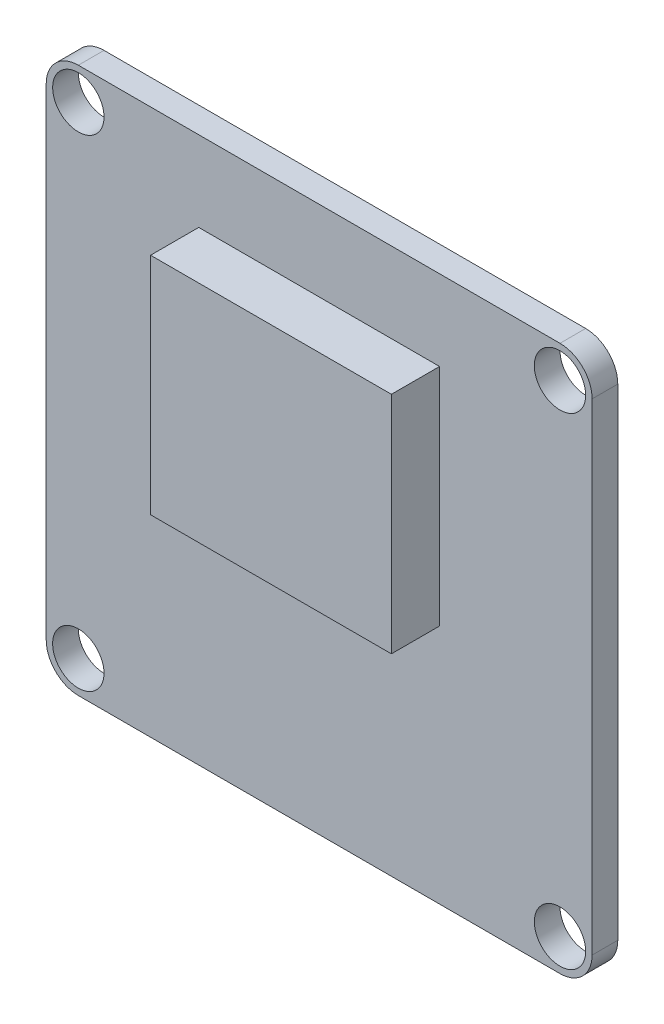
ISO-10303-21;
HEADER;
FILE_DESCRIPTION(('STEP AP214'),'2;1');
FILE_NAME('part.step','',(''),(''),'','','');
FILE_SCHEMA(('AUTOMOTIVE_DESIGN { 1 0 10303 214 1 1 1 1 }'));
ENDSEC;
DATA;
#1=APPLICATION_CONTEXT('core data for automotive mechanical design processes');
#2=APPLICATION_PROTOCOL_DEFINITION('international standard','automotive_design',2000,#1);
#3=PRODUCT_CONTEXT('',#1,'mechanical');
#4=PRODUCT('Part','Part','',(#3));
#5=PRODUCT_RELATED_PRODUCT_CATEGORY('part','',(#4));
#6=PRODUCT_DEFINITION_FORMATION('','',#4);
#7=PRODUCT_DEFINITION_CONTEXT('part definition',#1,'design');
#8=PRODUCT_DEFINITION('design','',#6,#7);
#9=PRODUCT_DEFINITION_SHAPE('','',#8);
#10=(LENGTH_UNIT() NAMED_UNIT(*) SI_UNIT(.MILLI.,.METRE.));
#11=(NAMED_UNIT(*) PLANE_ANGLE_UNIT() SI_UNIT($,.RADIAN.));
#12=(NAMED_UNIT(*) SI_UNIT($,.STERADIAN.) SOLID_ANGLE_UNIT());
#13=UNCERTAINTY_MEASURE_WITH_UNIT(LENGTH_MEASURE(1.E-05),#10,'distance_accuracy_value','');
#14=(GEOMETRIC_REPRESENTATION_CONTEXT(3) GLOBAL_UNCERTAINTY_ASSIGNED_CONTEXT((#13)) GLOBAL_UNIT_ASSIGNED_CONTEXT((#10,
#11,#12)) REPRESENTATION_CONTEXT('',''));
#15=CARTESIAN_POINT('',(0.,0.,0.));
#16=DIRECTION('',(0.,0.,1.));
#17=DIRECTION('',(1.,0.,0.));
#18=AXIS2_PLACEMENT_3D('',#15,#16,#17);
#19=CARTESIAN_POINT('',(-13.2356576243425,11.611622238612,1.6));
#20=DIRECTION('',(0.,0.,1.));
#21=DIRECTION('',(1.,0.,0.));
#22=AXIS2_PLACEMENT_3D('',#19,#20,#21);
#23=PLANE('',#22);
#24=CARTESIAN_POINT('',(-13.2356576243425,11.611622238612,1.6));
#25=DIRECTION('',(0.,0.,1.));
#26=DIRECTION('',(-1.,0.,0.));
#27=AXIS2_PLACEMENT_3D('',#24,#25,#26);
#28=CIRCLE('',#27,1.6);
#29=CARTESIAN_POINT('',(-14.8356576243425,11.611622238612,1.6));
#30=VERTEX_POINT('',#29);
#31=EDGE_CURVE('E203',#30,#30,#28,.T.);
#32=ORIENTED_EDGE('',*,*,#31,.F.);
#33=EDGE_LOOP('',(#32));
#34=FACE_BOUND('',#33,.T.);
#35=CARTESIAN_POINT('',(16.7643423756575,11.611622238612,1.6));
#36=DIRECTION('',(0.,0.,1.));
#37=DIRECTION('',(1.,0.,0.));
#38=AXIS2_PLACEMENT_3D('',#35,#36,#37);
#39=CIRCLE('',#38,1.6);
#40=CARTESIAN_POINT('',(18.3643423756575,11.611622238612,1.6));
#41=VERTEX_POINT('',#40);
#42=EDGE_CURVE('E148',#41,#41,#39,.T.);
#43=ORIENTED_EDGE('',*,*,#42,.F.);
#44=EDGE_LOOP('',(#43));
#45=FACE_BOUND('',#44,.T.);
#46=CARTESIAN_POINT('',(-13.2356576243425,11.611622238612,1.6));
#47=DIRECTION('',(0.,0.,1.));
#48=DIRECTION('',(1.,0.,0.));
#49=AXIS2_PLACEMENT_3D('',#46,#47,#48);
#50=CIRCLE('',#49,2.);
#51=CARTESIAN_POINT('',(-13.2356576243425,13.611622238612,1.6));
#52=VERTEX_POINT('',#51);
#53=CARTESIAN_POINT('',(-15.2356576243425,11.611622238612,1.6));
#54=VERTEX_POINT('',#53);
#55=EDGE_CURVE('E160',#52,#54,#50,.T.);
#56=ORIENTED_EDGE('',*,*,#55,.T.);
#57=DIRECTION('',(0.,-1.,0.));
#58=VECTOR('',#57,1.);
#59=CARTESIAN_POINT('',(-15.2356576243425,11.611622238612,1.6));
#60=LINE('',#59,#58);
#61=CARTESIAN_POINT('',(-15.2356576243425,-18.388377761388,1.6));
#62=VERTEX_POINT('',#61);
#63=EDGE_CURVE('E100',#54,#62,#60,.T.);
#64=ORIENTED_EDGE('',*,*,#63,.T.);
#65=CARTESIAN_POINT('',(-13.2356576243425,-18.388377761388,1.6));
#66=DIRECTION('',(0.,0.,1.));
#67=DIRECTION('',(1.,0.,0.));
#68=AXIS2_PLACEMENT_3D('',#65,#66,#67);
#69=CIRCLE('',#68,2.);
#70=CARTESIAN_POINT('',(-13.2356576243425,-20.388377761388,1.6));
#71=VERTEX_POINT('',#70);
#72=EDGE_CURVE('E175',#62,#71,#69,.T.);
#73=ORIENTED_EDGE('',*,*,#72,.T.);
#74=DIRECTION('',(1.,0.,0.));
#75=VECTOR('',#74,1.);
#76=CARTESIAN_POINT('',(-13.2356576243425,-20.388377761388,1.6));
#77=LINE('',#76,#75);
#78=CARTESIAN_POINT('',(16.7643423756575,-20.388377761388,1.6));
#79=VERTEX_POINT('',#78);
#80=EDGE_CURVE('E188',#71,#79,#77,.T.);
#81=ORIENTED_EDGE('',*,*,#80,.T.);
#82=CARTESIAN_POINT('',(16.7643423756575,-18.388377761388,1.6));
#83=DIRECTION('',(0.,0.,1.));
#84=DIRECTION('',(1.,0.,0.));
#85=AXIS2_PLACEMENT_3D('',#82,#83,#84);
#86=CIRCLE('',#85,2.);
#87=CARTESIAN_POINT('',(18.7643423756575,-18.388377761388,1.6));
#88=VERTEX_POINT('',#87);
#89=EDGE_CURVE('E123',#79,#88,#86,.T.);
#90=ORIENTED_EDGE('',*,*,#89,.T.);
#91=DIRECTION('',(0.,1.,0.));
#92=VECTOR('',#91,1.);
#93=CARTESIAN_POINT('',(18.7643423756575,11.611622238612,1.6));
#94=LINE('',#93,#92);
#95=CARTESIAN_POINT('',(18.7643423756575,11.611622238612,1.6));
#96=VERTEX_POINT('',#95);
#97=EDGE_CURVE('E116',#88,#96,#94,.T.);
#98=ORIENTED_EDGE('',*,*,#97,.T.);
#99=CARTESIAN_POINT('',(16.7643423756575,11.611622238612,1.6));
#100=DIRECTION('',(0.,0.,1.));
#101=DIRECTION('',(-1.,0.,0.));
#102=AXIS2_PLACEMENT_3D('',#99,#100,#101);
#103=CIRCLE('',#102,2.);
#104=CARTESIAN_POINT('',(16.7643423756575,13.611622238612,1.6));
#105=VERTEX_POINT('',#104);
#106=EDGE_CURVE('E120',#96,#105,#103,.T.);
#107=ORIENTED_EDGE('',*,*,#106,.T.);
#108=DIRECTION('',(-1.,0.,0.));
#109=VECTOR('',#108,1.);
#110=CARTESIAN_POINT('',(-13.2356576243425,13.611622238612,1.6));
#111=LINE('',#110,#109);
#112=EDGE_CURVE('E59',#105,#52,#111,.T.);
#113=ORIENTED_EDGE('',*,*,#112,.T.);
#114=EDGE_LOOP('',(#56,#64,#73,#81,#90,#98,#107,#113));
#115=FACE_BOUND('',#114,.T.);
#116=CARTESIAN_POINT('',(16.7643423756575,-18.388377761388,1.6));
#117=DIRECTION('',(0.,0.,1.));
#118=DIRECTION('',(-1.,0.,0.));
#119=AXIS2_PLACEMENT_3D('',#116,#117,#118);
#120=CIRCLE('',#119,1.6);
#121=CARTESIAN_POINT('',(15.1643423756575,-18.388377761388,1.6));
#122=VERTEX_POINT('',#121);
#123=EDGE_CURVE('E197',#122,#122,#120,.T.);
#124=ORIENTED_EDGE('',*,*,#123,.F.);
#125=EDGE_LOOP('',(#124));
#126=FACE_BOUND('',#125,.T.);
#127=CARTESIAN_POINT('',(-13.2356576243425,-18.388377761388,1.6));
#128=DIRECTION('',(0.,0.,1.));
#129=DIRECTION('',(1.,0.,0.));
#130=AXIS2_PLACEMENT_3D('',#127,#128,#129);
#131=CIRCLE('',#130,1.6);
#132=CARTESIAN_POINT('',(-11.6356576243425,-18.388377761388,1.6));
#133=VERTEX_POINT('',#132);
#134=EDGE_CURVE('E209',#133,#133,#131,.T.);
#135=ORIENTED_EDGE('',*,*,#134,.F.);
#136=EDGE_LOOP('',(#135));
#137=FACE_BOUND('',#136,.T.);
#138=DIRECTION('',(-1.,0.,0.));
#139=VECTOR('',#138,1.);
#140=CARTESIAN_POINT('',(9.26434237565751,8.61162223861204,1.6));
#141=LINE('',#140,#139);
#142=CARTESIAN_POINT('',(9.26434237565751,8.61162223861204,1.6));
#143=VERTEX_POINT('',#142);
#144=CARTESIAN_POINT('',(-5.73565762434249,8.61162223861203,1.6));
#145=VERTEX_POINT('',#144);
#146=EDGE_CURVE('E233',#143,#145,#141,.T.);
#147=ORIENTED_EDGE('',*,*,#146,.F.);
#148=DIRECTION('',(0.,1.,0.));
#149=VECTOR('',#148,1.);
#150=CARTESIAN_POINT('',(9.26434237565751,8.61162223861204,1.6));
#151=LINE('',#150,#149);
#152=CARTESIAN_POINT('',(9.26434237565751,-5.38837776138796,1.6));
#153=VERTEX_POINT('',#152);
#154=EDGE_CURVE('E236',#153,#143,#151,.T.);
#155=ORIENTED_EDGE('',*,*,#154,.F.);
#156=DIRECTION('',(1.,0.,0.));
#157=VECTOR('',#156,1.);
#158=CARTESIAN_POINT('',(9.26434237565751,-5.38837776138796,1.6));
#159=LINE('',#158,#157);
#160=CARTESIAN_POINT('',(-5.73565762434248,-5.38837776138797,1.6));
#161=VERTEX_POINT('',#160);
#162=EDGE_CURVE('E228',#161,#153,#159,.T.);
#163=ORIENTED_EDGE('',*,*,#162,.F.);
#164=DIRECTION('',(0.,-1.,0.));
#165=VECTOR('',#164,1.);
#166=CARTESIAN_POINT('',(-5.73565762434249,8.61162223861203,1.6));
#167=LINE('',#166,#165);
#168=EDGE_CURVE('E231',#145,#161,#167,.T.);
#169=ORIENTED_EDGE('',*,*,#168,.F.);
#170=EDGE_LOOP('',(#147,#155,#163,#169));
#171=FACE_BOUND('',#170,.T.);
#172=ADVANCED_FACE('F35',(#34,#45,#115,#126,#137,#171),#23,.T.);
#173=CARTESIAN_POINT('',(-13.2356576243425,11.611622238612,0.));
#174=DIRECTION('',(0.,0.,1.));
#175=DIRECTION('',(1.,0.,0.));
#176=AXIS2_PLACEMENT_3D('',#173,#174,#175);
#177=PLANE('',#176);
#178=CARTESIAN_POINT('',(-13.2356576243425,11.611622238612,0.));
#179=DIRECTION('',(0.,0.,1.));
#180=DIRECTION('',(1.,0.,0.));
#181=AXIS2_PLACEMENT_3D('',#178,#179,#180);
#182=CIRCLE('',#181,2.);
#183=CARTESIAN_POINT('',(-13.2356576243425,13.611622238612,0.));
#184=VERTEX_POINT('',#183);
#185=CARTESIAN_POINT('',(-15.2356576243425,11.611622238612,0.));
#186=VERTEX_POINT('',#185);
#187=EDGE_CURVE('E144',#184,#186,#182,.T.);
#188=ORIENTED_EDGE('',*,*,#187,.F.);
#189=DIRECTION('',(-1.,0.,0.));
#190=VECTOR('',#189,1.);
#191=CARTESIAN_POINT('',(-13.2356576243425,13.611622238612,0.));
#192=LINE('',#191,#190);
#193=CARTESIAN_POINT('',(16.7643423756575,13.611622238612,0.));
#194=VERTEX_POINT('',#193);
#195=EDGE_CURVE('E92',#194,#184,#192,.T.);
#196=ORIENTED_EDGE('',*,*,#195,.F.);
#197=CARTESIAN_POINT('',(16.7643423756575,11.611622238612,0.));
#198=DIRECTION('',(0.,0.,1.));
#199=DIRECTION('',(-1.,0.,0.));
#200=AXIS2_PLACEMENT_3D('',#197,#198,#199);
#201=CIRCLE('',#200,2.);
#202=CARTESIAN_POINT('',(18.7643423756575,11.611622238612,0.));
#203=VERTEX_POINT('',#202);
#204=EDGE_CURVE('E157',#203,#194,#201,.T.);
#205=ORIENTED_EDGE('',*,*,#204,.F.);
#206=DIRECTION('',(0.,1.,0.));
#207=VECTOR('',#206,1.);
#208=CARTESIAN_POINT('',(18.7643423756575,11.611622238612,0.));
#209=LINE('',#208,#207);
#210=CARTESIAN_POINT('',(18.7643423756575,-18.388377761388,0.));
#211=VERTEX_POINT('',#210);
#212=EDGE_CURVE('E132',#211,#203,#209,.T.);
#213=ORIENTED_EDGE('',*,*,#212,.F.);
#214=CARTESIAN_POINT('',(16.7643423756575,-18.388377761388,0.));
#215=DIRECTION('',(0.,0.,1.));
#216=DIRECTION('',(1.,0.,0.));
#217=AXIS2_PLACEMENT_3D('',#214,#215,#216);
#218=CIRCLE('',#217,2.);
#219=CARTESIAN_POINT('',(16.7643423756575,-20.388377761388,0.));
#220=VERTEX_POINT('',#219);
#221=EDGE_CURVE('E154',#220,#211,#218,.T.);
#222=ORIENTED_EDGE('',*,*,#221,.F.);
#223=DIRECTION('',(1.,0.,0.));
#224=VECTOR('',#223,1.);
#225=CARTESIAN_POINT('',(-13.2356576243425,-20.388377761388,0.));
#226=LINE('',#225,#224);
#227=CARTESIAN_POINT('',(-13.2356576243425,-20.388377761388,0.));
#228=VERTEX_POINT('',#227);
#229=EDGE_CURVE('E152',#228,#220,#226,.T.);
#230=ORIENTED_EDGE('',*,*,#229,.F.);
#231=CARTESIAN_POINT('',(-13.2356576243425,-18.388377761388,0.));
#232=DIRECTION('',(0.,0.,1.));
#233=DIRECTION('',(1.,0.,0.));
#234=AXIS2_PLACEMENT_3D('',#231,#232,#233);
#235=CIRCLE('',#234,2.);
#236=CARTESIAN_POINT('',(-15.2356576243425,-18.388377761388,0.));
#237=VERTEX_POINT('',#236);
#238=EDGE_CURVE('E150',#237,#228,#235,.T.);
#239=ORIENTED_EDGE('',*,*,#238,.F.);
#240=DIRECTION('',(0.,-1.,0.));
#241=VECTOR('',#240,1.);
#242=CARTESIAN_POINT('',(-15.2356576243425,11.611622238612,0.));
#243=LINE('',#242,#241);
#244=EDGE_CURVE('E147',#186,#237,#243,.T.);
#245=ORIENTED_EDGE('',*,*,#244,.F.);
#246=EDGE_LOOP('',(#188,#196,#205,#213,#222,#230,#239,#245));
#247=FACE_BOUND('',#246,.T.);
#248=CARTESIAN_POINT('',(16.7643423756575,11.611622238612,0.));
#249=DIRECTION('',(0.,0.,1.));
#250=DIRECTION('',(1.,0.,0.));
#251=AXIS2_PLACEMENT_3D('',#248,#249,#250);
#252=CIRCLE('',#251,1.6);
#253=CARTESIAN_POINT('',(18.3643423756575,11.611622238612,0.));
#254=VERTEX_POINT('',#253);
#255=EDGE_CURVE('E194',#254,#254,#252,.T.);
#256=ORIENTED_EDGE('',*,*,#255,.T.);
#257=EDGE_LOOP('',(#256));
#258=FACE_BOUND('',#257,.T.);
#259=CARTESIAN_POINT('',(16.7643423756575,-18.388377761388,0.));
#260=DIRECTION('',(0.,0.,1.));
#261=DIRECTION('',(-1.,0.,0.));
#262=AXIS2_PLACEMENT_3D('',#259,#260,#261);
#263=CIRCLE('',#262,1.6);
#264=CARTESIAN_POINT('',(15.1643423756575,-18.388377761388,0.));
#265=VERTEX_POINT('',#264);
#266=EDGE_CURVE('E200',#265,#265,#263,.T.);
#267=ORIENTED_EDGE('',*,*,#266,.T.);
#268=EDGE_LOOP('',(#267));
#269=FACE_BOUND('',#268,.T.);
#270=CARTESIAN_POINT('',(-13.2356576243425,11.611622238612,0.));
#271=DIRECTION('',(0.,0.,1.));
#272=DIRECTION('',(-1.,0.,0.));
#273=AXIS2_PLACEMENT_3D('',#270,#271,#272);
#274=CIRCLE('',#273,1.6);
#275=CARTESIAN_POINT('',(-14.8356576243425,11.611622238612,0.));
#276=VERTEX_POINT('',#275);
#277=EDGE_CURVE('E206',#276,#276,#274,.T.);
#278=ORIENTED_EDGE('',*,*,#277,.T.);
#279=EDGE_LOOP('',(#278));
#280=FACE_BOUND('',#279,.T.);
#281=CARTESIAN_POINT('',(-13.2356576243425,-18.388377761388,0.));
#282=DIRECTION('',(0.,0.,1.));
#283=DIRECTION('',(1.,0.,0.));
#284=AXIS2_PLACEMENT_3D('',#281,#282,#283);
#285=CIRCLE('',#284,1.6);
#286=CARTESIAN_POINT('',(-11.6356576243425,-18.388377761388,0.));
#287=VERTEX_POINT('',#286);
#288=EDGE_CURVE('E212',#287,#287,#285,.T.);
#289=ORIENTED_EDGE('',*,*,#288,.T.);
#290=EDGE_LOOP('',(#289));
#291=FACE_BOUND('',#290,.T.);
#292=ADVANCED_FACE('F179',(#247,#258,#269,#280,#291),#177,.F.);
#293=CARTESIAN_POINT('',(-13.2356576243425,11.611622238612,1.6));
#294=DIRECTION('',(0.,0.,-1.));
#295=DIRECTION('',(-1.,0.,0.));
#296=AXIS2_PLACEMENT_3D('',#293,#294,#295);
#297=CYLINDRICAL_SURFACE('',#296,2.);
#298=ORIENTED_EDGE('',*,*,#187,.T.);
#299=DIRECTION('',(0.,0.,-1.));
#300=VECTOR('',#299,1.);
#301=CARTESIAN_POINT('',(-15.2356576243425,11.611622238612,1.6));
#302=LINE('',#301,#300);
#303=EDGE_CURVE('E11',#54,#186,#302,.T.);
#304=ORIENTED_EDGE('',*,*,#303,.F.);
#305=ORIENTED_EDGE('',*,*,#55,.F.);
#306=DIRECTION('',(0.,0.,-1.));
#307=VECTOR('',#306,1.);
#308=CARTESIAN_POINT('',(-13.2356576243425,13.611622238612,1.6));
#309=LINE('',#308,#307);
#310=EDGE_CURVE('E140',#52,#184,#309,.T.);
#311=ORIENTED_EDGE('',*,*,#310,.T.);
#312=EDGE_LOOP('',(#298,#304,#305,#311));
#313=FACE_BOUND('',#312,.T.);
#314=ADVANCED_FACE('F37',(#313),#297,.T.);
#315=CARTESIAN_POINT('',(-15.2356576243425,11.611622238612,1.6));
#316=DIRECTION('',(1.,0.,0.));
#317=DIRECTION('',(0.,1.,0.));
#318=AXIS2_PLACEMENT_3D('',#315,#316,#317);
#319=PLANE('',#318);
#320=ORIENTED_EDGE('',*,*,#244,.T.);
#321=DIRECTION('',(0.,0.,-1.));
#322=VECTOR('',#321,1.);
#323=CARTESIAN_POINT('',(-15.2356576243425,-18.388377761388,1.6));
#324=LINE('',#323,#322);
#325=EDGE_CURVE('E43',#62,#237,#324,.T.);
#326=ORIENTED_EDGE('',*,*,#325,.F.);
#327=ORIENTED_EDGE('',*,*,#63,.F.);
#328=ORIENTED_EDGE('',*,*,#303,.T.);
#329=EDGE_LOOP('',(#320,#326,#327,#328));
#330=FACE_BOUND('',#329,.T.);
#331=ADVANCED_FACE('F305',(#330),#319,.F.);
#332=CARTESIAN_POINT('',(-13.2356576243425,-18.388377761388,1.6));
#333=DIRECTION('',(0.,0.,-1.));
#334=DIRECTION('',(-1.,0.,0.));
#335=AXIS2_PLACEMENT_3D('',#332,#333,#334);
#336=CYLINDRICAL_SURFACE('',#335,2.);
#337=ORIENTED_EDGE('',*,*,#238,.T.);
#338=DIRECTION('',(0.,0.,-1.));
#339=VECTOR('',#338,1.);
#340=CARTESIAN_POINT('',(-13.2356576243425,-20.388377761388,1.6));
#341=LINE('',#340,#339);
#342=EDGE_CURVE('E167',#71,#228,#341,.T.);
#343=ORIENTED_EDGE('',*,*,#342,.F.);
#344=ORIENTED_EDGE('',*,*,#72,.F.);
#345=ORIENTED_EDGE('',*,*,#325,.T.);
#346=EDGE_LOOP('',(#337,#343,#344,#345));
#347=FACE_BOUND('',#346,.T.);
#348=ADVANCED_FACE('F173',(#347),#336,.T.);
#349=CARTESIAN_POINT('',(-13.2356576243425,-20.388377761388,1.6));
#350=DIRECTION('',(0.,1.,0.));
#351=DIRECTION('',(0.,0.,1.));
#352=AXIS2_PLACEMENT_3D('',#349,#350,#351);
#353=PLANE('',#352);
#354=ORIENTED_EDGE('',*,*,#229,.T.);
#355=DIRECTION('',(0.,0.,-1.));
#356=VECTOR('',#355,1.);
#357=CARTESIAN_POINT('',(16.7643423756575,-20.388377761388,1.6));
#358=LINE('',#357,#356);
#359=EDGE_CURVE('E164',#79,#220,#358,.T.);
#360=ORIENTED_EDGE('',*,*,#359,.F.);
#361=ORIENTED_EDGE('',*,*,#80,.F.);
#362=ORIENTED_EDGE('',*,*,#342,.T.);
#363=EDGE_LOOP('',(#354,#360,#361,#362));
#364=FACE_BOUND('',#363,.T.);
#365=ADVANCED_FACE('F184',(#364),#353,.F.);
#366=CARTESIAN_POINT('',(16.7643423756575,-18.388377761388,1.6));
#367=DIRECTION('',(0.,0.,-1.));
#368=DIRECTION('',(-1.,0.,0.));
#369=AXIS2_PLACEMENT_3D('',#366,#367,#368);
#370=CYLINDRICAL_SURFACE('',#369,2.);
#371=ORIENTED_EDGE('',*,*,#221,.T.);
#372=DIRECTION('',(0.,0.,-1.));
#373=VECTOR('',#372,1.);
#374=CARTESIAN_POINT('',(18.7643423756575,-18.388377761388,1.6));
#375=LINE('',#374,#373);
#376=EDGE_CURVE('E135',#88,#211,#375,.T.);
#377=ORIENTED_EDGE('',*,*,#376,.F.);
#378=ORIENTED_EDGE('',*,*,#89,.F.);
#379=ORIENTED_EDGE('',*,*,#359,.T.);
#380=EDGE_LOOP('',(#371,#377,#378,#379));
#381=FACE_BOUND('',#380,.T.);
#382=ADVANCED_FACE('F187',(#381),#370,.T.);
#383=CARTESIAN_POINT('',(18.7643423756575,11.611622238612,1.6));
#384=DIRECTION('',(-1.,0.,0.));
#385=DIRECTION('',(0.,0.,1.));
#386=AXIS2_PLACEMENT_3D('',#383,#384,#385);
#387=PLANE('',#386);
#388=ORIENTED_EDGE('',*,*,#212,.T.);
#389=DIRECTION('',(0.,0.,-1.));
#390=VECTOR('',#389,1.);
#391=CARTESIAN_POINT('',(18.7643423756575,11.611622238612,1.6));
#392=LINE('',#391,#390);
#393=EDGE_CURVE('E129',#96,#203,#392,.T.);
#394=ORIENTED_EDGE('',*,*,#393,.F.);
#395=ORIENTED_EDGE('',*,*,#97,.F.);
#396=ORIENTED_EDGE('',*,*,#376,.T.);
#397=EDGE_LOOP('',(#388,#394,#395,#396));
#398=FACE_BOUND('',#397,.T.);
#399=ADVANCED_FACE('F130',(#398),#387,.F.);
#400=CARTESIAN_POINT('',(16.7643423756575,11.611622238612,1.6));
#401=DIRECTION('',(0.,0.,-1.));
#402=DIRECTION('',(-1.,0.,0.));
#403=AXIS2_PLACEMENT_3D('',#400,#401,#402);
#404=CYLINDRICAL_SURFACE('',#403,2.);
#405=ORIENTED_EDGE('',*,*,#204,.T.);
#406=DIRECTION('',(0.,0.,-1.));
#407=VECTOR('',#406,1.);
#408=CARTESIAN_POINT('',(16.7643423756575,13.611622238612,1.6));
#409=LINE('',#408,#407);
#410=EDGE_CURVE('E136',#105,#194,#409,.T.);
#411=ORIENTED_EDGE('',*,*,#410,.F.);
#412=ORIENTED_EDGE('',*,*,#106,.F.);
#413=ORIENTED_EDGE('',*,*,#393,.T.);
#414=EDGE_LOOP('',(#405,#411,#412,#413));
#415=FACE_BOUND('',#414,.T.);
#416=ADVANCED_FACE('F138',(#415),#404,.T.);
#417=CARTESIAN_POINT('',(-13.2356576243425,13.611622238612,1.6));
#418=DIRECTION('',(0.,-1.,0.));
#419=DIRECTION('',(0.,0.,-1.));
#420=AXIS2_PLACEMENT_3D('',#417,#418,#419);
#421=PLANE('',#420);
#422=ORIENTED_EDGE('',*,*,#195,.T.);
#423=ORIENTED_EDGE('',*,*,#310,.F.);
#424=ORIENTED_EDGE('',*,*,#112,.F.);
#425=ORIENTED_EDGE('',*,*,#410,.T.);
#426=EDGE_LOOP('',(#422,#423,#424,#425));
#427=FACE_BOUND('',#426,.T.);
#428=ADVANCED_FACE('F293',(#427),#421,.F.);
#429=CARTESIAN_POINT('',(16.7643423756575,11.611622238612,1.6));
#430=DIRECTION('',(0.,0.,-1.));
#431=DIRECTION('',(-1.,0.,0.));
#432=AXIS2_PLACEMENT_3D('',#429,#430,#431);
#433=CYLINDRICAL_SURFACE('',#432,1.6);
#434=ORIENTED_EDGE('',*,*,#42,.T.);
#435=EDGE_LOOP('',(#434));
#436=FACE_BOUND('',#435,.T.);
#437=ORIENTED_EDGE('',*,*,#255,.F.);
#438=EDGE_LOOP('',(#437));
#439=FACE_BOUND('',#438,.T.);
#440=ADVANCED_FACE('F290',(#436,#439),#433,.F.);
#441=CARTESIAN_POINT('',(16.7643423756575,-18.388377761388,1.6));
#442=DIRECTION('',(0.,0.,-1.));
#443=DIRECTION('',(-1.,0.,0.));
#444=AXIS2_PLACEMENT_3D('',#441,#442,#443);
#445=CYLINDRICAL_SURFACE('',#444,1.6);
#446=ORIENTED_EDGE('',*,*,#123,.T.);
#447=EDGE_LOOP('',(#446));
#448=FACE_BOUND('',#447,.T.);
#449=ORIENTED_EDGE('',*,*,#266,.F.);
#450=EDGE_LOOP('',(#449));
#451=FACE_BOUND('',#450,.T.);
#452=ADVANCED_FACE('F365',(#448,#451),#445,.F.);
#453=CARTESIAN_POINT('',(-13.2356576243425,11.611622238612,1.6));
#454=DIRECTION('',(0.,0.,-1.));
#455=DIRECTION('',(-1.,0.,0.));
#456=AXIS2_PLACEMENT_3D('',#453,#454,#455);
#457=CYLINDRICAL_SURFACE('',#456,1.6);
#458=ORIENTED_EDGE('',*,*,#31,.T.);
#459=EDGE_LOOP('',(#458));
#460=FACE_BOUND('',#459,.T.);
#461=ORIENTED_EDGE('',*,*,#277,.F.);
#462=EDGE_LOOP('',(#461));
#463=FACE_BOUND('',#462,.T.);
#464=ADVANCED_FACE('F373',(#460,#463),#457,.F.);
#465=CARTESIAN_POINT('',(-13.2356576243425,-18.388377761388,1.6));
#466=DIRECTION('',(0.,0.,-1.));
#467=DIRECTION('',(-1.,0.,0.));
#468=AXIS2_PLACEMENT_3D('',#465,#466,#467);
#469=CYLINDRICAL_SURFACE('',#468,1.6);
#470=ORIENTED_EDGE('',*,*,#134,.T.);
#471=EDGE_LOOP('',(#470));
#472=FACE_BOUND('',#471,.T.);
#473=ORIENTED_EDGE('',*,*,#288,.F.);
#474=EDGE_LOOP('',(#473));
#475=FACE_BOUND('',#474,.T.);
#476=ADVANCED_FACE('F381',(#472,#475),#469,.F.);
#477=CARTESIAN_POINT('',(9.26434237565751,8.61162223861204,4.6));
#478=DIRECTION('',(-1.,0.,0.));
#479=DIRECTION('',(0.,-1.,0.));
#480=AXIS2_PLACEMENT_3D('',#477,#478,#479);
#481=PLANE('',#480);
#482=ORIENTED_EDGE('',*,*,#154,.T.);
#483=DIRECTION('',(0.,0.,-1.));
#484=VECTOR('',#483,1.);
#485=CARTESIAN_POINT('',(9.26434237565751,8.61162223861204,4.6));
#486=LINE('',#485,#484);
#487=CARTESIAN_POINT('',(9.26434237565751,8.61162223861204,4.6));
#488=VERTEX_POINT('',#487);
#489=EDGE_CURVE('E215',#488,#143,#486,.T.);
#490=ORIENTED_EDGE('',*,*,#489,.F.);
#491=DIRECTION('',(0.,1.,0.));
#492=VECTOR('',#491,1.);
#493=CARTESIAN_POINT('',(9.26434237565751,8.61162223861204,4.6));
#494=LINE('',#493,#492);
#495=CARTESIAN_POINT('',(9.26434237565751,-5.38837776138796,4.6));
#496=VERTEX_POINT('',#495);
#497=EDGE_CURVE('E230',#496,#488,#494,.T.);
#498=ORIENTED_EDGE('',*,*,#497,.F.);
#499=DIRECTION('',(0.,0.,-1.));
#500=VECTOR('',#499,1.);
#501=CARTESIAN_POINT('',(9.26434237565751,-5.38837776138796,4.6));
#502=LINE('',#501,#500);
#503=EDGE_CURVE('E224',#496,#153,#502,.T.);
#504=ORIENTED_EDGE('',*,*,#503,.T.);
#505=EDGE_LOOP('',(#482,#490,#498,#504));
#506=FACE_BOUND('',#505,.T.);
#507=ADVANCED_FACE('F259',(#506),#481,.F.);
#508=CARTESIAN_POINT('',(9.26434237565751,8.61162223861204,4.6));
#509=DIRECTION('',(0.,-1.,0.));
#510=DIRECTION('',(1.,0.,0.));
#511=AXIS2_PLACEMENT_3D('',#508,#509,#510);
#512=PLANE('',#511);
#513=ORIENTED_EDGE('',*,*,#146,.T.);
#514=DIRECTION('',(0.,0.,-1.));
#515=VECTOR('',#514,1.);
#516=CARTESIAN_POINT('',(-5.73565762434249,8.61162223861203,4.6));
#517=LINE('',#516,#515);
#518=CARTESIAN_POINT('',(-5.73565762434249,8.61162223861203,4.6));
#519=VERTEX_POINT('',#518);
#520=EDGE_CURVE('E220',#519,#145,#517,.T.);
#521=ORIENTED_EDGE('',*,*,#520,.F.);
#522=DIRECTION('',(-1.,0.,0.));
#523=VECTOR('',#522,1.);
#524=CARTESIAN_POINT('',(9.26434237565751,8.61162223861204,4.6));
#525=LINE('',#524,#523);
#526=EDGE_CURVE('E244',#488,#519,#525,.T.);
#527=ORIENTED_EDGE('',*,*,#526,.F.);
#528=ORIENTED_EDGE('',*,*,#489,.T.);
#529=EDGE_LOOP('',(#513,#521,#527,#528));
#530=FACE_BOUND('',#529,.T.);
#531=ADVANCED_FACE('F264',(#530),#512,.F.);
#532=CARTESIAN_POINT('',(-5.73565762434249,8.61162223861203,4.6));
#533=DIRECTION('',(1.,0.,0.));
#534=DIRECTION('',(0.,1.,0.));
#535=AXIS2_PLACEMENT_3D('',#532,#533,#534);
#536=PLANE('',#535);
#537=ORIENTED_EDGE('',*,*,#168,.T.);
#538=DIRECTION('',(0.,0.,-1.));
#539=VECTOR('',#538,1.);
#540=CARTESIAN_POINT('',(-5.73565762434248,-5.38837776138797,4.6));
#541=LINE('',#540,#539);
#542=CARTESIAN_POINT('',(-5.73565762434248,-5.38837776138797,4.6));
#543=VERTEX_POINT('',#542);
#544=EDGE_CURVE('E50',#543,#161,#541,.T.);
#545=ORIENTED_EDGE('',*,*,#544,.F.);
#546=DIRECTION('',(0.,-1.,0.));
#547=VECTOR('',#546,1.);
#548=CARTESIAN_POINT('',(-5.73565762434249,8.61162223861203,4.6));
#549=LINE('',#548,#547);
#550=EDGE_CURVE('E241',#519,#543,#549,.T.);
#551=ORIENTED_EDGE('',*,*,#550,.F.);
#552=ORIENTED_EDGE('',*,*,#520,.T.);
#553=EDGE_LOOP('',(#537,#545,#551,#552));
#554=FACE_BOUND('',#553,.T.);
#555=ADVANCED_FACE('F273',(#554),#536,.F.);
#556=CARTESIAN_POINT('',(9.26434237565751,-5.38837776138796,4.6));
#557=DIRECTION('',(0.,1.,0.));
#558=DIRECTION('',(-1.,0.,0.));
#559=AXIS2_PLACEMENT_3D('',#556,#557,#558);
#560=PLANE('',#559);
#561=ORIENTED_EDGE('',*,*,#162,.T.);
#562=ORIENTED_EDGE('',*,*,#503,.F.);
#563=DIRECTION('',(1.,0.,0.));
#564=VECTOR('',#563,1.);
#565=CARTESIAN_POINT('',(9.26434237565751,-5.38837776138796,4.6));
#566=LINE('',#565,#564);
#567=EDGE_CURVE('E227',#543,#496,#566,.T.);
#568=ORIENTED_EDGE('',*,*,#567,.F.);
#569=ORIENTED_EDGE('',*,*,#544,.T.);
#570=EDGE_LOOP('',(#561,#562,#568,#569));
#571=FACE_BOUND('',#570,.T.);
#572=ADVANCED_FACE('F276',(#571),#560,.F.);
#573=CARTESIAN_POINT('',(0.,0.,4.6));
#574=DIRECTION('',(0.,0.,-1.));
#575=DIRECTION('',(-1.,0.,0.));
#576=AXIS2_PLACEMENT_3D('',#573,#574,#575);
#577=PLANE('',#576);
#578=ORIENTED_EDGE('',*,*,#497,.T.);
#579=ORIENTED_EDGE('',*,*,#526,.T.);
#580=ORIENTED_EDGE('',*,*,#550,.T.);
#581=ORIENTED_EDGE('',*,*,#567,.T.);
#582=EDGE_LOOP('',(#578,#579,#580,#581));
#583=FACE_BOUND('',#582,.T.);
#584=ADVANCED_FACE('F252',(#583),#577,.F.);
#585=CLOSED_SHELL('',(#172,#292,#314,#331,#348,#365,#382,#399,#416,#428,#440,#452,#464,#476,
#507,#531,#555,#572,#584));
#586=MANIFOLD_SOLID_BREP('B2',#585);
#587=ADVANCED_BREP_SHAPE_REPRESENTATION('',(#18,#586),#14);
#588=SHAPE_DEFINITION_REPRESENTATION(#9,#587);
ENDSEC;
END-ISO-10303-21;
